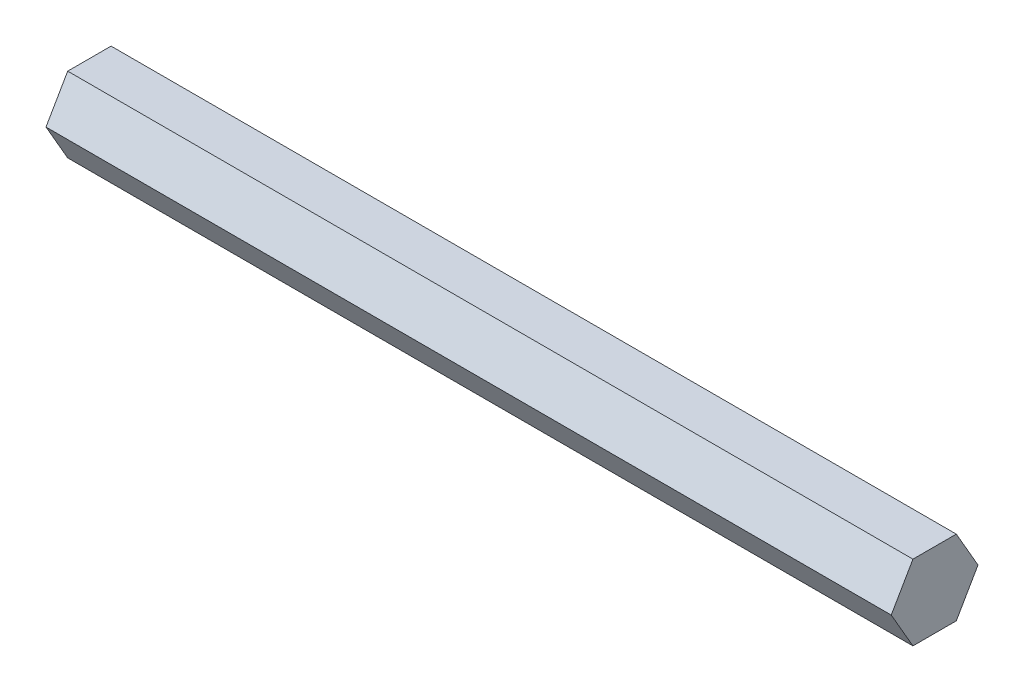
ISO-10303-21;
HEADER;
FILE_DESCRIPTION(('STEP AP214'),'2;1');
FILE_NAME('part.step','',(''),(''),'','','');
FILE_SCHEMA(('AUTOMOTIVE_DESIGN { 1 0 10303 214 1 1 1 1 }'));
ENDSEC;
DATA;
#1=APPLICATION_CONTEXT('core data for automotive mechanical design processes');
#2=APPLICATION_PROTOCOL_DEFINITION('international standard','automotive_design',2000,#1);
#3=PRODUCT_CONTEXT('',#1,'mechanical');
#4=PRODUCT('Part','Part','',(#3));
#5=PRODUCT_RELATED_PRODUCT_CATEGORY('part','',(#4));
#6=PRODUCT_DEFINITION_FORMATION('','',#4);
#7=PRODUCT_DEFINITION_CONTEXT('part definition',#1,'design');
#8=PRODUCT_DEFINITION('design','',#6,#7);
#9=PRODUCT_DEFINITION_SHAPE('','',#8);
#10=(LENGTH_UNIT() NAMED_UNIT(*) SI_UNIT(.MILLI.,.METRE.));
#11=(NAMED_UNIT(*) PLANE_ANGLE_UNIT() SI_UNIT($,.RADIAN.));
#12=(NAMED_UNIT(*) SI_UNIT($,.STERADIAN.) SOLID_ANGLE_UNIT());
#13=UNCERTAINTY_MEASURE_WITH_UNIT(LENGTH_MEASURE(1.E-05),#10,'distance_accuracy_value','');
#14=(GEOMETRIC_REPRESENTATION_CONTEXT(3) GLOBAL_UNCERTAINTY_ASSIGNED_CONTEXT((#13)) GLOBAL_UNIT_ASSIGNED_CONTEXT((#10,
#11,#12)) REPRESENTATION_CONTEXT('',''));
#15=CARTESIAN_POINT('',(0.,0.,0.));
#16=DIRECTION('',(0.,0.,1.));
#17=DIRECTION('',(1.,0.,0.));
#18=AXIS2_PLACEMENT_3D('',#15,#16,#17);
#19=CARTESIAN_POINT('',(142.875,-6.34999999999994,-3.66617420935418));
#20=DIRECTION('',(0.,0.499999999999995,0.866025403784441));
#21=DIRECTION('',(0.,-0.866025403784442,0.499999999999995));
#22=AXIS2_PLACEMENT_3D('',#19,#20,#21);
#23=PLANE('',#22);
#24=DIRECTION('',(0.,0.866025403784442,-0.499999999999995));
#25=VECTOR('',#24,1.);
#26=CARTESIAN_POINT('',(0.,-6.34999999999994,-3.66617420935418));
#27=LINE('',#26,#25);
#28=CARTESIAN_POINT('',(0.,-6.34999999999994,-3.66617420935418));
#29=VERTEX_POINT('',#28);
#30=CARTESIAN_POINT('',(0.,0.,-7.33234841870822));
#31=VERTEX_POINT('',#30);
#32=EDGE_CURVE('E116',#29,#31,#27,.T.);
#33=ORIENTED_EDGE('',*,*,#32,.T.);
#34=DIRECTION('',(-1.,0.,0.));
#35=VECTOR('',#34,1.);
#36=CARTESIAN_POINT('',(142.875,0.,-7.33234841870822));
#37=LINE('',#36,#35);
#38=CARTESIAN_POINT('',(142.875,0.,-7.33234841870822));
#39=VERTEX_POINT('',#38);
#40=EDGE_CURVE('E11',#39,#31,#37,.T.);
#41=ORIENTED_EDGE('',*,*,#40,.F.);
#42=DIRECTION('',(0.,0.866025403784442,-0.499999999999995));
#43=VECTOR('',#42,1.);
#44=CARTESIAN_POINT('',(142.875,-6.34999999999994,-3.66617420935418));
#45=LINE('',#44,#43);
#46=CARTESIAN_POINT('',(142.875,-6.34999999999994,-3.66617420935418));
#47=VERTEX_POINT('',#46);
#48=EDGE_CURVE('E126',#47,#39,#45,.T.);
#49=ORIENTED_EDGE('',*,*,#48,.F.);
#50=DIRECTION('',(-1.,0.,0.));
#51=VECTOR('',#50,1.);
#52=CARTESIAN_POINT('',(142.875,-6.34999999999994,-3.66617420935418));
#53=LINE('',#52,#51);
#54=EDGE_CURVE('E112',#47,#29,#53,.T.);
#55=ORIENTED_EDGE('',*,*,#54,.T.);
#56=EDGE_LOOP('',(#33,#41,#49,#55));
#57=FACE_BOUND('',#56,.T.);
#58=ADVANCED_FACE('F32',(#57),#23,.F.);
#59=CARTESIAN_POINT('',(142.875,0.,-7.33234841870822));
#60=DIRECTION('',(0.,-0.500000000000001,0.866025403784438));
#61=DIRECTION('',(0.,-0.866025403784438,-0.500000000000001));
#62=AXIS2_PLACEMENT_3D('',#59,#60,#61);
#63=PLANE('',#62);
#64=DIRECTION('',(0.,0.866025403784438,0.500000000000001));
#65=VECTOR('',#64,1.);
#66=CARTESIAN_POINT('',(0.,0.,-7.33234841870822));
#67=LINE('',#66,#65);
#68=CARTESIAN_POINT('',(0.,6.34999999999999,-3.6661742093541));
#69=VERTEX_POINT('',#68);
#70=EDGE_CURVE('E119',#31,#69,#67,.T.);
#71=ORIENTED_EDGE('',*,*,#70,.T.);
#72=DIRECTION('',(-1.,0.,0.));
#73=VECTOR('',#72,1.);
#74=CARTESIAN_POINT('',(142.875,6.34999999999999,-3.6661742093541));
#75=LINE('',#74,#73);
#76=CARTESIAN_POINT('',(142.875,6.34999999999999,-3.6661742093541));
#77=VERTEX_POINT('',#76);
#78=EDGE_CURVE('E40',#77,#69,#75,.T.);
#79=ORIENTED_EDGE('',*,*,#78,.F.);
#80=DIRECTION('',(0.,0.866025403784438,0.500000000000001));
#81=VECTOR('',#80,1.);
#82=CARTESIAN_POINT('',(142.875,0.,-7.33234841870822));
#83=LINE('',#82,#81);
#84=EDGE_CURVE('E85',#39,#77,#83,.T.);
#85=ORIENTED_EDGE('',*,*,#84,.F.);
#86=ORIENTED_EDGE('',*,*,#40,.T.);
#87=EDGE_LOOP('',(#71,#79,#85,#86));
#88=FACE_BOUND('',#87,.T.);
#89=ADVANCED_FACE('F150',(#88),#63,.F.);
#90=CARTESIAN_POINT('',(142.875,6.34999999999999,-3.6661742093541));
#91=DIRECTION('',(0.,-1.,0.));
#92=DIRECTION('',(0.,0.,-1.));
#93=AXIS2_PLACEMENT_3D('',#90,#91,#92);
#94=PLANE('',#93);
#95=DIRECTION('',(0.,0.,1.));
#96=VECTOR('',#95,1.);
#97=CARTESIAN_POINT('',(0.,6.34999999999999,-3.6661742093541));
#98=LINE('',#97,#96);
#99=CARTESIAN_POINT('',(0.,6.34999999999996,3.66617420935414));
#100=VERTEX_POINT('',#99);
#101=EDGE_CURVE('E121',#69,#100,#98,.T.);
#102=ORIENTED_EDGE('',*,*,#101,.T.);
#103=DIRECTION('',(-1.,0.,0.));
#104=VECTOR('',#103,1.);
#105=CARTESIAN_POINT('',(142.875,6.34999999999996,3.66617420935414));
#106=LINE('',#105,#104);
#107=CARTESIAN_POINT('',(142.875,6.34999999999996,3.66617420935414));
#108=VERTEX_POINT('',#107);
#109=EDGE_CURVE('E107',#108,#100,#106,.T.);
#110=ORIENTED_EDGE('',*,*,#109,.F.);
#111=DIRECTION('',(0.,0.,1.));
#112=VECTOR('',#111,1.);
#113=CARTESIAN_POINT('',(142.875,6.34999999999999,-3.6661742093541));
#114=LINE('',#113,#112);
#115=EDGE_CURVE('E98',#77,#108,#114,.T.);
#116=ORIENTED_EDGE('',*,*,#115,.F.);
#117=ORIENTED_EDGE('',*,*,#78,.T.);
#118=EDGE_LOOP('',(#102,#110,#116,#117));
#119=FACE_BOUND('',#118,.T.);
#120=ADVANCED_FACE('F132',(#119),#94,.F.);
#121=CARTESIAN_POINT('',(142.875,6.34999999999996,3.66617420935414));
#122=DIRECTION('',(0.,-0.499999999999995,-0.866025403784441));
#123=DIRECTION('',(0.,0.866025403784441,-0.499999999999995));
#124=AXIS2_PLACEMENT_3D('',#121,#122,#123);
#125=PLANE('',#124);
#126=DIRECTION('',(0.,-0.866025403784441,0.499999999999995));
#127=VECTOR('',#126,1.);
#128=CARTESIAN_POINT('',(0.,6.34999999999996,3.66617420935414));
#129=LINE('',#128,#127);
#130=CARTESIAN_POINT('',(0.,0.,7.33234841870822));
#131=VERTEX_POINT('',#130);
#132=EDGE_CURVE('E106',#100,#131,#129,.T.);
#133=ORIENTED_EDGE('',*,*,#132,.T.);
#134=DIRECTION('',(-1.,0.,0.));
#135=VECTOR('',#134,1.);
#136=CARTESIAN_POINT('',(142.875,0.,7.33234841870822));
#137=LINE('',#136,#135);
#138=CARTESIAN_POINT('',(142.875,0.,7.33234841870822));
#139=VERTEX_POINT('',#138);
#140=EDGE_CURVE('E103',#139,#131,#137,.T.);
#141=ORIENTED_EDGE('',*,*,#140,.F.);
#142=DIRECTION('',(0.,-0.866025403784441,0.499999999999995));
#143=VECTOR('',#142,1.);
#144=CARTESIAN_POINT('',(142.875,6.34999999999996,3.66617420935414));
#145=LINE('',#144,#143);
#146=EDGE_CURVE('E92',#108,#139,#145,.T.);
#147=ORIENTED_EDGE('',*,*,#146,.F.);
#148=ORIENTED_EDGE('',*,*,#109,.T.);
#149=EDGE_LOOP('',(#133,#141,#147,#148));
#150=FACE_BOUND('',#149,.T.);
#151=ADVANCED_FACE('F104',(#150),#125,.F.);
#152=CARTESIAN_POINT('',(142.875,0.,7.33234841870822));
#153=DIRECTION('',(0.,0.500000000000007,-0.866025403784435));
#154=DIRECTION('',(0.,0.866025403784435,0.500000000000007));
#155=AXIS2_PLACEMENT_3D('',#152,#153,#154);
#156=PLANE('',#155);
#157=DIRECTION('',(0.,-0.866025403784434,-0.500000000000007));
#158=VECTOR('',#157,1.);
#159=CARTESIAN_POINT('',(0.,0.,7.33234841870822));
#160=LINE('',#159,#158);
#161=CARTESIAN_POINT('',(0.,-6.35000000000001,3.66617420935405));
#162=VERTEX_POINT('',#161);
#163=EDGE_CURVE('E71',#131,#162,#160,.T.);
#164=ORIENTED_EDGE('',*,*,#163,.T.);
#165=DIRECTION('',(-1.,0.,0.));
#166=VECTOR('',#165,1.);
#167=CARTESIAN_POINT('',(142.875,-6.35000000000001,3.66617420935405));
#168=LINE('',#167,#166);
#169=CARTESIAN_POINT('',(142.875,-6.35000000000001,3.66617420935405));
#170=VERTEX_POINT('',#169);
#171=EDGE_CURVE('E108',#170,#162,#168,.T.);
#172=ORIENTED_EDGE('',*,*,#171,.F.);
#173=DIRECTION('',(0.,-0.866025403784434,-0.500000000000007));
#174=VECTOR('',#173,1.);
#175=CARTESIAN_POINT('',(142.875,0.,7.33234841870822));
#176=LINE('',#175,#174);
#177=EDGE_CURVE('E96',#139,#170,#176,.T.);
#178=ORIENTED_EDGE('',*,*,#177,.F.);
#179=ORIENTED_EDGE('',*,*,#140,.T.);
#180=EDGE_LOOP('',(#164,#172,#178,#179));
#181=FACE_BOUND('',#180,.T.);
#182=ADVANCED_FACE('F110',(#181),#156,.F.);
#183=CARTESIAN_POINT('',(142.875,-6.35000000000001,3.66617420935405));
#184=DIRECTION('',(0.,1.,0.));
#185=DIRECTION('',(0.,0.,1.));
#186=AXIS2_PLACEMENT_3D('',#183,#184,#185);
#187=PLANE('',#186);
#188=DIRECTION('',(0.,0.,-1.));
#189=VECTOR('',#188,1.);
#190=CARTESIAN_POINT('',(0.,-6.35000000000001,3.66617420935405));
#191=LINE('',#190,#189);
#192=EDGE_CURVE('E77',#162,#29,#191,.T.);
#193=ORIENTED_EDGE('',*,*,#192,.T.);
#194=ORIENTED_EDGE('',*,*,#54,.F.);
#195=DIRECTION('',(0.,0.,-1.));
#196=VECTOR('',#195,1.);
#197=CARTESIAN_POINT('',(142.875,-6.35000000000001,3.66617420935405));
#198=LINE('',#197,#196);
#199=EDGE_CURVE('E48',#170,#47,#198,.T.);
#200=ORIENTED_EDGE('',*,*,#199,.F.);
#201=ORIENTED_EDGE('',*,*,#171,.T.);
#202=EDGE_LOOP('',(#193,#194,#200,#201));
#203=FACE_BOUND('',#202,.T.);
#204=ADVANCED_FACE('F139',(#203),#187,.F.);
#205=CARTESIAN_POINT('',(142.875,0.,0.));
#206=DIRECTION('',(1.,0.,0.));
#207=DIRECTION('',(0.,0.,-1.));
#208=AXIS2_PLACEMENT_3D('',#205,#206,#207);
#209=PLANE('',#208);
#210=ORIENTED_EDGE('',*,*,#48,.T.);
#211=ORIENTED_EDGE('',*,*,#84,.T.);
#212=ORIENTED_EDGE('',*,*,#115,.T.);
#213=ORIENTED_EDGE('',*,*,#146,.T.);
#214=ORIENTED_EDGE('',*,*,#177,.T.);
#215=ORIENTED_EDGE('',*,*,#199,.T.);
#216=EDGE_LOOP('',(#210,#211,#212,#213,#214,#215));
#217=FACE_BOUND('',#216,.T.);
#218=ADVANCED_FACE('F94',(#217),#209,.T.);
#219=CARTESIAN_POINT('',(0.,0.,0.));
#220=DIRECTION('',(1.,0.,0.));
#221=DIRECTION('',(0.,0.,-1.));
#222=AXIS2_PLACEMENT_3D('',#219,#220,#221);
#223=PLANE('',#222);
#224=ORIENTED_EDGE('',*,*,#32,.F.);
#225=ORIENTED_EDGE('',*,*,#192,.F.);
#226=ORIENTED_EDGE('',*,*,#163,.F.);
#227=ORIENTED_EDGE('',*,*,#132,.F.);
#228=ORIENTED_EDGE('',*,*,#101,.F.);
#229=ORIENTED_EDGE('',*,*,#70,.F.);
#230=EDGE_LOOP('',(#224,#225,#226,#227,#228,#229));
#231=FACE_BOUND('',#230,.T.);
#232=ADVANCED_FACE('F135',(#231),#223,.F.);
#233=CLOSED_SHELL('',(#58,#89,#120,#151,#182,#204,#218,#232));
#234=MANIFOLD_SOLID_BREP('B2',#233);
#235=ADVANCED_BREP_SHAPE_REPRESENTATION('',(#18,#234),#14);
#236=SHAPE_DEFINITION_REPRESENTATION(#9,#235);
ENDSEC;
END-ISO-10303-21;
